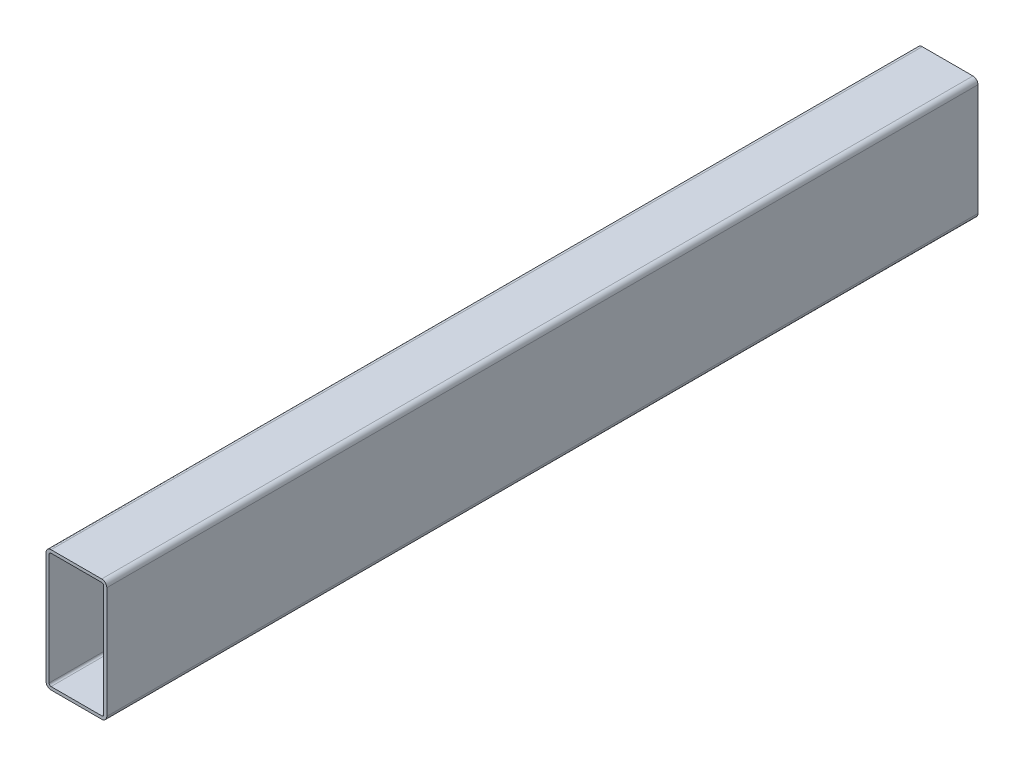
ISO-10303-21;
HEADER;
FILE_DESCRIPTION(('STEP AP214'),'2;1');
FILE_NAME('part.step','',(''),(''),'','','');
FILE_SCHEMA(('AUTOMOTIVE_DESIGN { 1 0 10303 214 1 1 1 1 }'));
ENDSEC;
DATA;
#1=APPLICATION_CONTEXT('core data for automotive mechanical design processes');
#2=APPLICATION_PROTOCOL_DEFINITION('international standard','automotive_design',2000,#1);
#3=PRODUCT_CONTEXT('',#1,'mechanical');
#4=PRODUCT('Part','Part','',(#3));
#5=PRODUCT_RELATED_PRODUCT_CATEGORY('part','',(#4));
#6=PRODUCT_DEFINITION_FORMATION('','',#4);
#7=PRODUCT_DEFINITION_CONTEXT('part definition',#1,'design');
#8=PRODUCT_DEFINITION('design','',#6,#7);
#9=PRODUCT_DEFINITION_SHAPE('','',#8);
#10=(LENGTH_UNIT() NAMED_UNIT(*) SI_UNIT(.MILLI.,.METRE.));
#11=(NAMED_UNIT(*) PLANE_ANGLE_UNIT() SI_UNIT($,.RADIAN.));
#12=(NAMED_UNIT(*) SI_UNIT($,.STERADIAN.) SOLID_ANGLE_UNIT());
#13=UNCERTAINTY_MEASURE_WITH_UNIT(LENGTH_MEASURE(1.E-05),#10,'distance_accuracy_value','');
#14=(GEOMETRIC_REPRESENTATION_CONTEXT(3) GLOBAL_UNCERTAINTY_ASSIGNED_CONTEXT((#13)) GLOBAL_UNIT_ASSIGNED_CONTEXT((#10,
#11,#12)) REPRESENTATION_CONTEXT('',''));
#15=CARTESIAN_POINT('',(0.,0.,0.));
#16=DIRECTION('',(0.,0.,1.));
#17=DIRECTION('',(1.,0.,0.));
#18=AXIS2_PLACEMENT_3D('',#15,#16,#17);
#19=CARTESIAN_POINT('',(25.,-55.,-430.));
#20=DIRECTION('',(0.,0.,1.));
#21=DIRECTION('',(1.,0.,0.));
#22=AXIS2_PLACEMENT_3D('',#19,#20,#21);
#23=CYLINDRICAL_SURFACE('',#22,5.);
#24=DIRECTION('',(0.,0.,1.));
#25=VECTOR('',#24,1.);
#26=CARTESIAN_POINT('',(30.,-55.,-430.));
#27=LINE('',#26,#25);
#28=CARTESIAN_POINT('',(30.,-55.,-430.));
#29=VERTEX_POINT('',#28);
#30=CARTESIAN_POINT('',(30.,-55.,430.));
#31=VERTEX_POINT('',#30);
#32=EDGE_CURVE('E132',#29,#31,#27,.T.);
#33=ORIENTED_EDGE('',*,*,#32,.T.);
#34=CARTESIAN_POINT('',(25.,-55.,430.));
#35=DIRECTION('',(0.,0.,1.));
#36=DIRECTION('',(-1.,0.,0.));
#37=AXIS2_PLACEMENT_3D('',#34,#35,#36);
#38=CIRCLE('',#37,5.);
#39=CARTESIAN_POINT('',(25.,-60.,430.));
#40=VERTEX_POINT('',#39);
#41=EDGE_CURVE('E285',#40,#31,#38,.T.);
#42=ORIENTED_EDGE('',*,*,#41,.F.);
#43=DIRECTION('',(0.,0.,1.));
#44=VECTOR('',#43,1.);
#45=CARTESIAN_POINT('',(25.,-60.,-430.));
#46=LINE('',#45,#44);
#47=CARTESIAN_POINT('',(25.,-60.,-430.));
#48=VERTEX_POINT('',#47);
#49=EDGE_CURVE('E12',#48,#40,#46,.T.);
#50=ORIENTED_EDGE('',*,*,#49,.F.);
#51=CARTESIAN_POINT('',(25.,-55.,-430.));
#52=DIRECTION('',(0.,0.,1.));
#53=DIRECTION('',(-1.,0.,0.));
#54=AXIS2_PLACEMENT_3D('',#51,#52,#53);
#55=CIRCLE('',#54,5.);
#56=EDGE_CURVE('E328',#48,#29,#55,.T.);
#57=ORIENTED_EDGE('',*,*,#56,.T.);
#58=EDGE_LOOP('',(#33,#42,#50,#57));
#59=FACE_BOUND('',#58,.T.);
#60=ADVANCED_FACE('F129',(#59),#23,.T.);
#61=CARTESIAN_POINT('',(-25.,-60.,-430.));
#62=DIRECTION('',(0.,-1.,0.));
#63=DIRECTION('',(0.,0.,-1.));
#64=AXIS2_PLACEMENT_3D('',#61,#62,#63);
#65=PLANE('',#64);
#66=ORIENTED_EDGE('',*,*,#49,.T.);
#67=DIRECTION('',(1.,0.,0.));
#68=VECTOR('',#67,1.);
#69=CARTESIAN_POINT('',(-25.,-60.,430.));
#70=LINE('',#69,#68);
#71=CARTESIAN_POINT('',(-25.,-60.,430.));
#72=VERTEX_POINT('',#71);
#73=EDGE_CURVE('E306',#72,#40,#70,.T.);
#74=ORIENTED_EDGE('',*,*,#73,.F.);
#75=DIRECTION('',(0.,0.,1.));
#76=VECTOR('',#75,1.);
#77=CARTESIAN_POINT('',(-25.,-60.,-430.));
#78=LINE('',#77,#76);
#79=CARTESIAN_POINT('',(-25.,-60.,-430.));
#80=VERTEX_POINT('',#79);
#81=EDGE_CURVE('E137',#80,#72,#78,.T.);
#82=ORIENTED_EDGE('',*,*,#81,.F.);
#83=DIRECTION('',(1.,0.,0.));
#84=VECTOR('',#83,1.);
#85=CARTESIAN_POINT('',(-25.,-60.,-430.));
#86=LINE('',#85,#84);
#87=EDGE_CURVE('E359',#80,#48,#86,.T.);
#88=ORIENTED_EDGE('',*,*,#87,.T.);
#89=EDGE_LOOP('',(#66,#74,#82,#88));
#90=FACE_BOUND('',#89,.T.);
#91=ADVANCED_FACE('F380',(#90),#65,.T.);
#92=CARTESIAN_POINT('',(-25.,-55.,-430.));
#93=DIRECTION('',(0.,0.,1.));
#94=DIRECTION('',(1.,0.,0.));
#95=AXIS2_PLACEMENT_3D('',#92,#93,#94);
#96=CYLINDRICAL_SURFACE('',#95,5.);
#97=ORIENTED_EDGE('',*,*,#81,.T.);
#98=CARTESIAN_POINT('',(-25.,-55.,430.));
#99=DIRECTION('',(0.,0.,1.));
#100=DIRECTION('',(-1.,0.,0.));
#101=AXIS2_PLACEMENT_3D('',#98,#99,#100);
#102=CIRCLE('',#101,5.);
#103=CARTESIAN_POINT('',(-30.,-55.,430.));
#104=VERTEX_POINT('',#103);
#105=EDGE_CURVE('E303',#104,#72,#102,.T.);
#106=ORIENTED_EDGE('',*,*,#105,.F.);
#107=DIRECTION('',(0.,0.,1.));
#108=VECTOR('',#107,1.);
#109=CARTESIAN_POINT('',(-30.,-55.,-430.));
#110=LINE('',#109,#108);
#111=CARTESIAN_POINT('',(-30.,-55.,-430.));
#112=VERTEX_POINT('',#111);
#113=EDGE_CURVE('E363',#112,#104,#110,.T.);
#114=ORIENTED_EDGE('',*,*,#113,.F.);
#115=CARTESIAN_POINT('',(-25.,-55.,-430.));
#116=DIRECTION('',(0.,0.,1.));
#117=DIRECTION('',(-1.,0.,0.));
#118=AXIS2_PLACEMENT_3D('',#115,#116,#117);
#119=CIRCLE('',#118,5.);
#120=EDGE_CURVE('E356',#112,#80,#119,.T.);
#121=ORIENTED_EDGE('',*,*,#120,.T.);
#122=EDGE_LOOP('',(#97,#106,#114,#121));
#123=FACE_BOUND('',#122,.T.);
#124=ADVANCED_FACE('F401',(#123),#96,.T.);
#125=CARTESIAN_POINT('',(-30.,-55.,-430.));
#126=DIRECTION('',(-1.,0.,0.));
#127=DIRECTION('',(0.,0.,1.));
#128=AXIS2_PLACEMENT_3D('',#125,#126,#127);
#129=PLANE('',#128);
#130=ORIENTED_EDGE('',*,*,#113,.T.);
#131=DIRECTION('',(0.,-1.,0.));
#132=VECTOR('',#131,1.);
#133=CARTESIAN_POINT('',(-30.,-55.,430.));
#134=LINE('',#133,#132);
#135=CARTESIAN_POINT('',(-30.,55.,430.));
#136=VERTEX_POINT('',#135);
#137=EDGE_CURVE('E300',#136,#104,#134,.T.);
#138=ORIENTED_EDGE('',*,*,#137,.F.);
#139=DIRECTION('',(0.,0.,1.));
#140=VECTOR('',#139,1.);
#141=CARTESIAN_POINT('',(-30.,55.,-430.));
#142=LINE('',#141,#140);
#143=CARTESIAN_POINT('',(-30.,55.,-430.));
#144=VERTEX_POINT('',#143);
#145=EDGE_CURVE('E365',#144,#136,#142,.T.);
#146=ORIENTED_EDGE('',*,*,#145,.F.);
#147=DIRECTION('',(0.,-1.,0.));
#148=VECTOR('',#147,1.);
#149=CARTESIAN_POINT('',(-30.,-55.,-430.));
#150=LINE('',#149,#148);
#151=EDGE_CURVE('E353',#144,#112,#150,.T.);
#152=ORIENTED_EDGE('',*,*,#151,.T.);
#153=EDGE_LOOP('',(#130,#138,#146,#152));
#154=FACE_BOUND('',#153,.T.);
#155=ADVANCED_FACE('F398',(#154),#129,.T.);
#156=CARTESIAN_POINT('',(-25.,55.,-430.));
#157=DIRECTION('',(0.,0.,1.));
#158=DIRECTION('',(1.,0.,0.));
#159=AXIS2_PLACEMENT_3D('',#156,#157,#158);
#160=CYLINDRICAL_SURFACE('',#159,5.);
#161=ORIENTED_EDGE('',*,*,#145,.T.);
#162=CARTESIAN_POINT('',(-25.,55.,430.));
#163=DIRECTION('',(0.,0.,1.));
#164=DIRECTION('',(-1.,0.,0.));
#165=AXIS2_PLACEMENT_3D('',#162,#163,#164);
#166=CIRCLE('',#165,5.);
#167=CARTESIAN_POINT('',(-25.,60.,430.));
#168=VERTEX_POINT('',#167);
#169=EDGE_CURVE('E297',#168,#136,#166,.T.);
#170=ORIENTED_EDGE('',*,*,#169,.F.);
#171=DIRECTION('',(0.,0.,1.));
#172=VECTOR('',#171,1.);
#173=CARTESIAN_POINT('',(-25.,60.,-430.));
#174=LINE('',#173,#172);
#175=CARTESIAN_POINT('',(-25.,60.,-430.));
#176=VERTEX_POINT('',#175);
#177=EDGE_CURVE('E367',#176,#168,#174,.T.);
#178=ORIENTED_EDGE('',*,*,#177,.F.);
#179=CARTESIAN_POINT('',(-25.,55.,-430.));
#180=DIRECTION('',(0.,0.,1.));
#181=DIRECTION('',(-1.,0.,0.));
#182=AXIS2_PLACEMENT_3D('',#179,#180,#181);
#183=CIRCLE('',#182,5.);
#184=EDGE_CURVE('E350',#176,#144,#183,.T.);
#185=ORIENTED_EDGE('',*,*,#184,.T.);
#186=EDGE_LOOP('',(#161,#170,#178,#185));
#187=FACE_BOUND('',#186,.T.);
#188=ADVANCED_FACE('F396',(#187),#160,.T.);
#189=CARTESIAN_POINT('',(-25.,60.,-430.));
#190=DIRECTION('',(0.,1.,0.));
#191=DIRECTION('',(0.,0.,1.));
#192=AXIS2_PLACEMENT_3D('',#189,#190,#191);
#193=PLANE('',#192);
#194=ORIENTED_EDGE('',*,*,#177,.T.);
#195=DIRECTION('',(-1.,0.,0.));
#196=VECTOR('',#195,1.);
#197=CARTESIAN_POINT('',(-25.,60.,430.));
#198=LINE('',#197,#196);
#199=CARTESIAN_POINT('',(25.,60.,430.));
#200=VERTEX_POINT('',#199);
#201=EDGE_CURVE('E294',#200,#168,#198,.T.);
#202=ORIENTED_EDGE('',*,*,#201,.F.);
#203=DIRECTION('',(0.,0.,1.));
#204=VECTOR('',#203,1.);
#205=CARTESIAN_POINT('',(25.,60.,-430.));
#206=LINE('',#205,#204);
#207=CARTESIAN_POINT('',(25.,60.,-430.));
#208=VERTEX_POINT('',#207);
#209=EDGE_CURVE('E369',#208,#200,#206,.T.);
#210=ORIENTED_EDGE('',*,*,#209,.F.);
#211=DIRECTION('',(-1.,0.,0.));
#212=VECTOR('',#211,1.);
#213=CARTESIAN_POINT('',(-25.,60.,-430.));
#214=LINE('',#213,#212);
#215=EDGE_CURVE('E347',#208,#176,#214,.T.);
#216=ORIENTED_EDGE('',*,*,#215,.T.);
#217=EDGE_LOOP('',(#194,#202,#210,#216));
#218=FACE_BOUND('',#217,.T.);
#219=ADVANCED_FACE('F394',(#218),#193,.T.);
#220=CARTESIAN_POINT('',(25.,55.,-430.));
#221=DIRECTION('',(0.,0.,1.));
#222=DIRECTION('',(1.,0.,0.));
#223=AXIS2_PLACEMENT_3D('',#220,#221,#222);
#224=CYLINDRICAL_SURFACE('',#223,5.);
#225=ORIENTED_EDGE('',*,*,#209,.T.);
#226=CARTESIAN_POINT('',(25.,55.,430.));
#227=DIRECTION('',(0.,0.,1.));
#228=DIRECTION('',(-1.,0.,0.));
#229=AXIS2_PLACEMENT_3D('',#226,#227,#228);
#230=CIRCLE('',#229,5.);
#231=CARTESIAN_POINT('',(30.,55.,430.));
#232=VERTEX_POINT('',#231);
#233=EDGE_CURVE('E291',#232,#200,#230,.T.);
#234=ORIENTED_EDGE('',*,*,#233,.F.);
#235=DIRECTION('',(0.,0.,1.));
#236=VECTOR('',#235,1.);
#237=CARTESIAN_POINT('',(30.,55.,-430.));
#238=LINE('',#237,#236);
#239=CARTESIAN_POINT('',(30.,55.,-430.));
#240=VERTEX_POINT('',#239);
#241=EDGE_CURVE('E370',#240,#232,#238,.T.);
#242=ORIENTED_EDGE('',*,*,#241,.F.);
#243=CARTESIAN_POINT('',(25.,55.,-430.));
#244=DIRECTION('',(0.,0.,1.));
#245=DIRECTION('',(-1.,0.,0.));
#246=AXIS2_PLACEMENT_3D('',#243,#244,#245);
#247=CIRCLE('',#246,5.);
#248=EDGE_CURVE('E344',#240,#208,#247,.T.);
#249=ORIENTED_EDGE('',*,*,#248,.T.);
#250=EDGE_LOOP('',(#225,#234,#242,#249));
#251=FACE_BOUND('',#250,.T.);
#252=ADVANCED_FACE('F390',(#251),#224,.T.);
#253=CARTESIAN_POINT('',(30.,-55.,-430.));
#254=DIRECTION('',(1.,0.,0.));
#255=DIRECTION('',(0.,0.,-1.));
#256=AXIS2_PLACEMENT_3D('',#253,#254,#255);
#257=PLANE('',#256);
#258=ORIENTED_EDGE('',*,*,#241,.T.);
#259=DIRECTION('',(0.,1.,0.));
#260=VECTOR('',#259,1.);
#261=CARTESIAN_POINT('',(30.,-55.,430.));
#262=LINE('',#261,#260);
#263=EDGE_CURVE('E288',#31,#232,#262,.T.);
#264=ORIENTED_EDGE('',*,*,#263,.F.);
#265=ORIENTED_EDGE('',*,*,#32,.F.);
#266=DIRECTION('',(0.,1.,0.));
#267=VECTOR('',#266,1.);
#268=CARTESIAN_POINT('',(30.,-55.,-430.));
#269=LINE('',#268,#267);
#270=EDGE_CURVE('E341',#29,#240,#269,.T.);
#271=ORIENTED_EDGE('',*,*,#270,.T.);
#272=EDGE_LOOP('',(#258,#264,#265,#271));
#273=FACE_BOUND('',#272,.T.);
#274=ADVANCED_FACE('F374',(#273),#257,.T.);
#275=CARTESIAN_POINT('',(25.,-55.,-430.));
#276=DIRECTION('',(0.,0.,1.));
#277=DIRECTION('',(1.,0.,0.));
#278=AXIS2_PLACEMENT_3D('',#275,#276,#277);
#279=PLANE('',#278);
#280=DIRECTION('',(1.,0.,0.));
#281=VECTOR('',#280,1.);
#282=CARTESIAN_POINT('',(25.,-57.,-430.));
#283=LINE('',#282,#281);
#284=CARTESIAN_POINT('',(-25.,-57.,-430.));
#285=VERTEX_POINT('',#284);
#286=CARTESIAN_POINT('',(25.,-57.,-430.));
#287=VERTEX_POINT('',#286);
#288=EDGE_CURVE('E254',#285,#287,#283,.T.);
#289=ORIENTED_EDGE('',*,*,#288,.T.);
#290=CARTESIAN_POINT('',(25.,-55.,-430.));
#291=DIRECTION('',(0.,0.,-1.));
#292=DIRECTION('',(-1.,0.,0.));
#293=AXIS2_PLACEMENT_3D('',#290,#291,#292);
#294=CIRCLE('',#293,2.);
#295=CARTESIAN_POINT('',(27.,-55.,-430.));
#296=VERTEX_POINT('',#295);
#297=EDGE_CURVE('E309',#287,#296,#294,.F.);
#298=ORIENTED_EDGE('',*,*,#297,.T.);
#299=DIRECTION('',(0.,1.,0.));
#300=VECTOR('',#299,1.);
#301=CARTESIAN_POINT('',(27.,-55.,-430.));
#302=LINE('',#301,#300);
#303=CARTESIAN_POINT('',(27.,55.,-430.));
#304=VERTEX_POINT('',#303);
#305=EDGE_CURVE('E249',#296,#304,#302,.T.);
#306=ORIENTED_EDGE('',*,*,#305,.T.);
#307=CARTESIAN_POINT('',(25.,55.,-430.));
#308=DIRECTION('',(0.,0.,-1.));
#309=DIRECTION('',(-1.,0.,0.));
#310=AXIS2_PLACEMENT_3D('',#307,#308,#309);
#311=CIRCLE('',#310,2.);
#312=CARTESIAN_POINT('',(25.,57.,-430.));
#313=VERTEX_POINT('',#312);
#314=EDGE_CURVE('E145',#304,#313,#311,.F.);
#315=ORIENTED_EDGE('',*,*,#314,.T.);
#316=DIRECTION('',(-1.,0.,0.));
#317=VECTOR('',#316,1.);
#318=CARTESIAN_POINT('',(25.,57.,-430.));
#319=LINE('',#318,#317);
#320=CARTESIAN_POINT('',(-25.,57.,-430.));
#321=VERTEX_POINT('',#320);
#322=EDGE_CURVE('E313',#313,#321,#319,.T.);
#323=ORIENTED_EDGE('',*,*,#322,.T.);
#324=CARTESIAN_POINT('',(-25.,55.,-430.));
#325=DIRECTION('',(0.,0.,-1.));
#326=DIRECTION('',(-1.,0.,0.));
#327=AXIS2_PLACEMENT_3D('',#324,#325,#326);
#328=CIRCLE('',#327,2.);
#329=CARTESIAN_POINT('',(-27.,55.,-430.));
#330=VERTEX_POINT('',#329);
#331=EDGE_CURVE('E316',#321,#330,#328,.F.);
#332=ORIENTED_EDGE('',*,*,#331,.T.);
#333=DIRECTION('',(0.,-1.,0.));
#334=VECTOR('',#333,1.);
#335=CARTESIAN_POINT('',(-27.,-55.,-430.));
#336=LINE('',#335,#334);
#337=CARTESIAN_POINT('',(-27.,-55.,-430.));
#338=VERTEX_POINT('',#337);
#339=EDGE_CURVE('E319',#330,#338,#336,.T.);
#340=ORIENTED_EDGE('',*,*,#339,.T.);
#341=CARTESIAN_POINT('',(-25.,-55.,-430.));
#342=DIRECTION('',(0.,0.,-1.));
#343=DIRECTION('',(-1.,0.,0.));
#344=AXIS2_PLACEMENT_3D('',#341,#342,#343);
#345=CIRCLE('',#344,2.);
#346=EDGE_CURVE('E322',#338,#285,#345,.F.);
#347=ORIENTED_EDGE('',*,*,#346,.T.);
#348=EDGE_LOOP('',(#289,#298,#306,#315,#323,#332,#340,#347));
#349=FACE_BOUND('',#348,.T.);
#350=ORIENTED_EDGE('',*,*,#56,.F.);
#351=ORIENTED_EDGE('',*,*,#87,.F.);
#352=ORIENTED_EDGE('',*,*,#120,.F.);
#353=ORIENTED_EDGE('',*,*,#151,.F.);
#354=ORIENTED_EDGE('',*,*,#184,.F.);
#355=ORIENTED_EDGE('',*,*,#215,.F.);
#356=ORIENTED_EDGE('',*,*,#248,.F.);
#357=ORIENTED_EDGE('',*,*,#270,.F.);
#358=EDGE_LOOP('',(#350,#351,#352,#353,#354,#355,#356,#357));
#359=FACE_BOUND('',#358,.T.);
#360=ADVANCED_FACE('F384',(#349,#359),#279,.F.);
#361=CARTESIAN_POINT('',(25.,-55.,-430.));
#362=DIRECTION('',(0.,0.,1.));
#363=DIRECTION('',(1.,0.,0.));
#364=AXIS2_PLACEMENT_3D('',#361,#362,#363);
#365=CYLINDRICAL_SURFACE('',#364,2.);
#366=DIRECTION('',(0.,0.,1.));
#367=VECTOR('',#366,1.);
#368=CARTESIAN_POINT('',(25.,-57.,-430.));
#369=LINE('',#368,#367);
#370=CARTESIAN_POINT('',(25.,-57.,430.));
#371=VERTEX_POINT('',#370);
#372=EDGE_CURVE('E259',#287,#371,#369,.T.);
#373=ORIENTED_EDGE('',*,*,#372,.T.);
#374=CARTESIAN_POINT('',(25.,-55.,430.));
#375=DIRECTION('',(0.,0.,-1.));
#376=DIRECTION('',(-1.,0.,0.));
#377=AXIS2_PLACEMENT_3D('',#374,#375,#376);
#378=CIRCLE('',#377,2.);
#379=CARTESIAN_POINT('',(27.,-55.,430.));
#380=VERTEX_POINT('',#379);
#381=EDGE_CURVE('E257',#371,#380,#378,.F.);
#382=ORIENTED_EDGE('',*,*,#381,.T.);
#383=DIRECTION('',(0.,0.,1.));
#384=VECTOR('',#383,1.);
#385=CARTESIAN_POINT('',(27.,-55.,-430.));
#386=LINE('',#385,#384);
#387=EDGE_CURVE('E242',#296,#380,#386,.T.);
#388=ORIENTED_EDGE('',*,*,#387,.F.);
#389=ORIENTED_EDGE('',*,*,#297,.F.);
#390=EDGE_LOOP('',(#373,#382,#388,#389));
#391=FACE_BOUND('',#390,.T.);
#392=ADVANCED_FACE('F258',(#391),#365,.F.);
#393=CARTESIAN_POINT('',(25.,-57.,-430.));
#394=DIRECTION('',(0.,-1.,0.));
#395=DIRECTION('',(0.,0.,-1.));
#396=AXIS2_PLACEMENT_3D('',#393,#394,#395);
#397=PLANE('',#396);
#398=DIRECTION('',(0.,0.,1.));
#399=VECTOR('',#398,1.);
#400=CARTESIAN_POINT('',(-25.,-57.,-430.));
#401=LINE('',#400,#399);
#402=CARTESIAN_POINT('',(-25.,-57.,430.));
#403=VERTEX_POINT('',#402);
#404=EDGE_CURVE('E329',#285,#403,#401,.T.);
#405=ORIENTED_EDGE('',*,*,#404,.T.);
#406=DIRECTION('',(1.,0.,0.));
#407=VECTOR('',#406,1.);
#408=CARTESIAN_POINT('',(25.,-57.,430.));
#409=LINE('',#408,#407);
#410=EDGE_CURVE('E283',#403,#371,#409,.T.);
#411=ORIENTED_EDGE('',*,*,#410,.T.);
#412=ORIENTED_EDGE('',*,*,#372,.F.);
#413=ORIENTED_EDGE('',*,*,#288,.F.);
#414=EDGE_LOOP('',(#405,#411,#412,#413));
#415=FACE_BOUND('',#414,.T.);
#416=ADVANCED_FACE('F476',(#415),#397,.F.);
#417=CARTESIAN_POINT('',(-25.,-55.,-430.));
#418=DIRECTION('',(0.,0.,1.));
#419=DIRECTION('',(1.,0.,0.));
#420=AXIS2_PLACEMENT_3D('',#417,#418,#419);
#421=CYLINDRICAL_SURFACE('',#420,2.);
#422=DIRECTION('',(0.,0.,1.));
#423=VECTOR('',#422,1.);
#424=CARTESIAN_POINT('',(-27.,-55.,-430.));
#425=LINE('',#424,#423);
#426=CARTESIAN_POINT('',(-27.,-55.,430.));
#427=VERTEX_POINT('',#426);
#428=EDGE_CURVE('E331',#338,#427,#425,.T.);
#429=ORIENTED_EDGE('',*,*,#428,.T.);
#430=CARTESIAN_POINT('',(-25.,-55.,430.));
#431=DIRECTION('',(0.,0.,-1.));
#432=DIRECTION('',(-1.,0.,0.));
#433=AXIS2_PLACEMENT_3D('',#430,#431,#432);
#434=CIRCLE('',#433,2.);
#435=EDGE_CURVE('E280',#427,#403,#434,.F.);
#436=ORIENTED_EDGE('',*,*,#435,.T.);
#437=ORIENTED_EDGE('',*,*,#404,.F.);
#438=ORIENTED_EDGE('',*,*,#346,.F.);
#439=EDGE_LOOP('',(#429,#436,#437,#438));
#440=FACE_BOUND('',#439,.T.);
#441=ADVANCED_FACE('F485',(#440),#421,.F.);
#442=CARTESIAN_POINT('',(-27.,-55.,-430.));
#443=DIRECTION('',(-1.,0.,0.));
#444=DIRECTION('',(0.,0.,1.));
#445=AXIS2_PLACEMENT_3D('',#442,#443,#444);
#446=PLANE('',#445);
#447=DIRECTION('',(0.,0.,1.));
#448=VECTOR('',#447,1.);
#449=CARTESIAN_POINT('',(-27.,55.,-430.));
#450=LINE('',#449,#448);
#451=CARTESIAN_POINT('',(-27.,55.,430.));
#452=VERTEX_POINT('',#451);
#453=EDGE_CURVE('E333',#330,#452,#450,.T.);
#454=ORIENTED_EDGE('',*,*,#453,.T.);
#455=DIRECTION('',(0.,-1.,0.));
#456=VECTOR('',#455,1.);
#457=CARTESIAN_POINT('',(-27.,-55.,430.));
#458=LINE('',#457,#456);
#459=EDGE_CURVE('E277',#452,#427,#458,.T.);
#460=ORIENTED_EDGE('',*,*,#459,.T.);
#461=ORIENTED_EDGE('',*,*,#428,.F.);
#462=ORIENTED_EDGE('',*,*,#339,.F.);
#463=EDGE_LOOP('',(#454,#460,#461,#462));
#464=FACE_BOUND('',#463,.T.);
#465=ADVANCED_FACE('F495',(#464),#446,.F.);
#466=CARTESIAN_POINT('',(-25.,55.,-430.));
#467=DIRECTION('',(0.,0.,1.));
#468=DIRECTION('',(1.,0.,0.));
#469=AXIS2_PLACEMENT_3D('',#466,#467,#468);
#470=CYLINDRICAL_SURFACE('',#469,2.);
#471=DIRECTION('',(0.,0.,1.));
#472=VECTOR('',#471,1.);
#473=CARTESIAN_POINT('',(-25.,57.,-430.));
#474=LINE('',#473,#472);
#475=CARTESIAN_POINT('',(-25.,57.,430.));
#476=VERTEX_POINT('',#475);
#477=EDGE_CURVE('E335',#321,#476,#474,.T.);
#478=ORIENTED_EDGE('',*,*,#477,.T.);
#479=CARTESIAN_POINT('',(-25.,55.,430.));
#480=DIRECTION('',(0.,0.,-1.));
#481=DIRECTION('',(-1.,0.,0.));
#482=AXIS2_PLACEMENT_3D('',#479,#480,#481);
#483=CIRCLE('',#482,2.);
#484=EDGE_CURVE('E274',#476,#452,#483,.F.);
#485=ORIENTED_EDGE('',*,*,#484,.T.);
#486=ORIENTED_EDGE('',*,*,#453,.F.);
#487=ORIENTED_EDGE('',*,*,#331,.F.);
#488=EDGE_LOOP('',(#478,#485,#486,#487));
#489=FACE_BOUND('',#488,.T.);
#490=ADVANCED_FACE('F505',(#489),#470,.F.);
#491=CARTESIAN_POINT('',(25.,57.,-430.));
#492=DIRECTION('',(0.,1.,0.));
#493=DIRECTION('',(0.,0.,1.));
#494=AXIS2_PLACEMENT_3D('',#491,#492,#493);
#495=PLANE('',#494);
#496=DIRECTION('',(0.,0.,1.));
#497=VECTOR('',#496,1.);
#498=CARTESIAN_POINT('',(25.,57.,-430.));
#499=LINE('',#498,#497);
#500=CARTESIAN_POINT('',(25.,57.,430.));
#501=VERTEX_POINT('',#500);
#502=EDGE_CURVE('E337',#313,#501,#499,.T.);
#503=ORIENTED_EDGE('',*,*,#502,.T.);
#504=DIRECTION('',(-1.,0.,0.));
#505=VECTOR('',#504,1.);
#506=CARTESIAN_POINT('',(25.,57.,430.));
#507=LINE('',#506,#505);
#508=EDGE_CURVE('E269',#501,#476,#507,.T.);
#509=ORIENTED_EDGE('',*,*,#508,.T.);
#510=ORIENTED_EDGE('',*,*,#477,.F.);
#511=ORIENTED_EDGE('',*,*,#322,.F.);
#512=EDGE_LOOP('',(#503,#509,#510,#511));
#513=FACE_BOUND('',#512,.T.);
#514=ADVANCED_FACE('F515',(#513),#495,.F.);
#515=CARTESIAN_POINT('',(25.,55.,-430.));
#516=DIRECTION('',(0.,0.,1.));
#517=DIRECTION('',(1.,0.,0.));
#518=AXIS2_PLACEMENT_3D('',#515,#516,#517);
#519=CYLINDRICAL_SURFACE('',#518,2.);
#520=DIRECTION('',(0.,0.,1.));
#521=VECTOR('',#520,1.);
#522=CARTESIAN_POINT('',(27.,55.,-430.));
#523=LINE('',#522,#521);
#524=CARTESIAN_POINT('',(27.,55.,430.));
#525=VERTEX_POINT('',#524);
#526=EDGE_CURVE('E253',#304,#525,#523,.T.);
#527=ORIENTED_EDGE('',*,*,#526,.T.);
#528=CARTESIAN_POINT('',(25.,55.,430.));
#529=DIRECTION('',(0.,0.,-1.));
#530=DIRECTION('',(-1.,0.,0.));
#531=AXIS2_PLACEMENT_3D('',#528,#529,#530);
#532=CIRCLE('',#531,2.);
#533=EDGE_CURVE('E267',#525,#501,#532,.F.);
#534=ORIENTED_EDGE('',*,*,#533,.T.);
#535=ORIENTED_EDGE('',*,*,#502,.F.);
#536=ORIENTED_EDGE('',*,*,#314,.F.);
#537=EDGE_LOOP('',(#527,#534,#535,#536));
#538=FACE_BOUND('',#537,.T.);
#539=ADVANCED_FACE('F525',(#538),#519,.F.);
#540=CARTESIAN_POINT('',(27.,-55.,-430.));
#541=DIRECTION('',(1.,0.,0.));
#542=DIRECTION('',(0.,0.,-1.));
#543=AXIS2_PLACEMENT_3D('',#540,#541,#542);
#544=PLANE('',#543);
#545=ORIENTED_EDGE('',*,*,#387,.T.);
#546=DIRECTION('',(0.,1.,0.));
#547=VECTOR('',#546,1.);
#548=CARTESIAN_POINT('',(27.,-55.,430.));
#549=LINE('',#548,#547);
#550=EDGE_CURVE('E246',#380,#525,#549,.T.);
#551=ORIENTED_EDGE('',*,*,#550,.T.);
#552=ORIENTED_EDGE('',*,*,#526,.F.);
#553=ORIENTED_EDGE('',*,*,#305,.F.);
#554=EDGE_LOOP('',(#545,#551,#552,#553));
#555=FACE_BOUND('',#554,.T.);
#556=ADVANCED_FACE('F244',(#555),#544,.F.);
#557=CARTESIAN_POINT('',(25.,-55.,430.));
#558=DIRECTION('',(0.,0.,1.));
#559=DIRECTION('',(1.,0.,0.));
#560=AXIS2_PLACEMENT_3D('',#557,#558,#559);
#561=PLANE('',#560);
#562=ORIENTED_EDGE('',*,*,#41,.T.);
#563=ORIENTED_EDGE('',*,*,#263,.T.);
#564=ORIENTED_EDGE('',*,*,#233,.T.);
#565=ORIENTED_EDGE('',*,*,#201,.T.);
#566=ORIENTED_EDGE('',*,*,#169,.T.);
#567=ORIENTED_EDGE('',*,*,#137,.T.);
#568=ORIENTED_EDGE('',*,*,#105,.T.);
#569=ORIENTED_EDGE('',*,*,#73,.T.);
#570=EDGE_LOOP('',(#562,#563,#564,#565,#566,#567,#568,#569));
#571=FACE_BOUND('',#570,.T.);
#572=ORIENTED_EDGE('',*,*,#550,.F.);
#573=ORIENTED_EDGE('',*,*,#381,.F.);
#574=ORIENTED_EDGE('',*,*,#410,.F.);
#575=ORIENTED_EDGE('',*,*,#435,.F.);
#576=ORIENTED_EDGE('',*,*,#459,.F.);
#577=ORIENTED_EDGE('',*,*,#484,.F.);
#578=ORIENTED_EDGE('',*,*,#508,.F.);
#579=ORIENTED_EDGE('',*,*,#533,.F.);
#580=EDGE_LOOP('',(#572,#573,#574,#575,#576,#577,#578,#579));
#581=FACE_BOUND('',#580,.T.);
#582=ADVANCED_FACE('F264',(#571,#581),#561,.T.);
#583=CLOSED_SHELL('',(#60,#91,#124,#155,#188,#219,#252,#274,#360,#392,#416,#441,#465,#490,#514,
#539,#556,#582));
#584=MANIFOLD_SOLID_BREP('B2',#583);
#585=ADVANCED_BREP_SHAPE_REPRESENTATION('',(#18,#584),#14);
#586=SHAPE_DEFINITION_REPRESENTATION(#9,#585);
ENDSEC;
END-ISO-10303-21;
